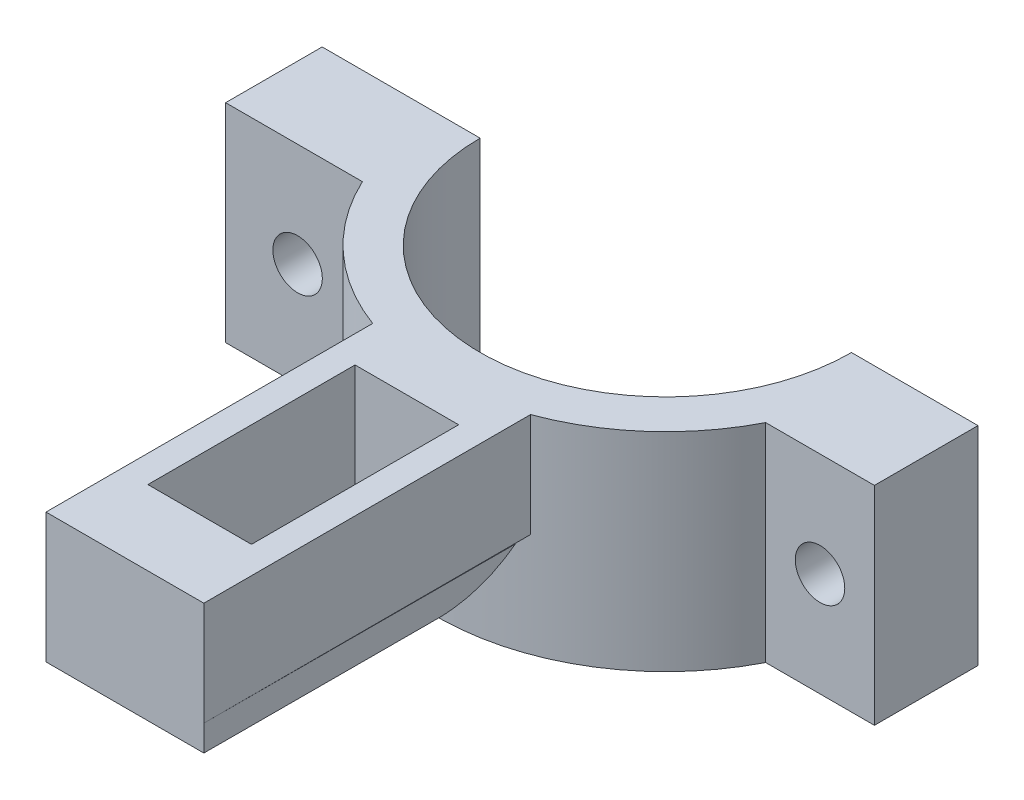
ISO-10303-21;
HEADER;
FILE_DESCRIPTION(('STEP AP214'),'2;1');
FILE_NAME('part.step','',(''),(''),'','','');
FILE_SCHEMA(('AUTOMOTIVE_DESIGN { 1 0 10303 214 1 1 1 1 }'));
ENDSEC;
DATA;
#1=APPLICATION_CONTEXT('core data for automotive mechanical design processes');
#2=APPLICATION_PROTOCOL_DEFINITION('international standard','automotive_design',2000,#1);
#3=PRODUCT_CONTEXT('',#1,'mechanical');
#4=PRODUCT('Part','Part','',(#3));
#5=PRODUCT_RELATED_PRODUCT_CATEGORY('part','',(#4));
#6=PRODUCT_DEFINITION_FORMATION('','',#4);
#7=PRODUCT_DEFINITION_CONTEXT('part definition',#1,'design');
#8=PRODUCT_DEFINITION('design','',#6,#7);
#9=PRODUCT_DEFINITION_SHAPE('','',#8);
#10=(LENGTH_UNIT() NAMED_UNIT(*) SI_UNIT(.MILLI.,.METRE.));
#11=(NAMED_UNIT(*) PLANE_ANGLE_UNIT() SI_UNIT($,.RADIAN.));
#12=(NAMED_UNIT(*) SI_UNIT($,.STERADIAN.) SOLID_ANGLE_UNIT());
#13=UNCERTAINTY_MEASURE_WITH_UNIT(LENGTH_MEASURE(1.E-05),#10,'distance_accuracy_value','');
#14=(GEOMETRIC_REPRESENTATION_CONTEXT(3) GLOBAL_UNCERTAINTY_ASSIGNED_CONTEXT((#13)) GLOBAL_UNIT_ASSIGNED_CONTEXT((#10,
#11,#12)) REPRESENTATION_CONTEXT('',''));
#15=CARTESIAN_POINT('',(0.,0.,0.));
#16=DIRECTION('',(0.,0.,1.));
#17=DIRECTION('',(1.,0.,0.));
#18=AXIS2_PLACEMENT_3D('',#15,#16,#17);
#19=CARTESIAN_POINT('',(-6.095,8.025,14.98));
#20=DIRECTION('',(0.,-1.,0.));
#21=DIRECTION('',(0.,0.,-1.));
#22=AXIS2_PLACEMENT_3D('',#19,#20,#21);
#23=PLANE('',#22);
#24=DIRECTION('',(0.,0.,1.));
#25=VECTOR('',#24,1.);
#26=CARTESIAN_POINT('',(6.095,8.025,14.98));
#27=LINE('',#26,#25);
#28=CARTESIAN_POINT('',(6.095,8.025,16.5429101127945));
#29=VERTEX_POINT('',#28);
#30=CARTESIAN_POINT('',(6.095,8.025,17.75));
#31=VERTEX_POINT('',#30);
#32=EDGE_CURVE('E279',#29,#31,#27,.T.);
#33=ORIENTED_EDGE('',*,*,#32,.T.);
#34=DIRECTION('',(1.,0.,0.));
#35=VECTOR('',#34,1.);
#36=CARTESIAN_POINT('',(-6.095,8.025,17.75));
#37=LINE('',#36,#35);
#38=CARTESIAN_POINT('',(-6.095,8.025,17.75));
#39=VERTEX_POINT('',#38);
#40=EDGE_CURVE('E193',#39,#31,#37,.T.);
#41=ORIENTED_EDGE('',*,*,#40,.F.);
#42=DIRECTION('',(0.,0.,1.));
#43=VECTOR('',#42,1.);
#44=CARTESIAN_POINT('',(-6.095,8.025,14.98));
#45=LINE('',#44,#43);
#46=CARTESIAN_POINT('',(-6.095,8.025,16.5429101127945));
#47=VERTEX_POINT('',#46);
#48=EDGE_CURVE('E277',#47,#39,#45,.T.);
#49=ORIENTED_EDGE('',*,*,#48,.F.);
#50=CARTESIAN_POINT('',(0.,8.025,0.));
#51=DIRECTION('',(0.,-1.,0.));
#52=DIRECTION('',(0.,0.,-1.));
#53=AXIS2_PLACEMENT_3D('',#50,#51,#52);
#54=CIRCLE('',#53,17.63);
#55=EDGE_CURVE('E317',#29,#47,#54,.T.);
#56=ORIENTED_EDGE('',*,*,#55,.F.);
#57=EDGE_LOOP('',(#33,#41,#49,#56));
#58=FACE_BOUND('',#57,.T.);
#59=ADVANCED_FACE('F41',(#58),#23,.T.);
#60=CARTESIAN_POINT('',(0.,16.05,0.));
#61=DIRECTION('',(0.,-1.,0.));
#62=DIRECTION('',(0.,0.,-1.));
#63=AXIS2_PLACEMENT_3D('',#60,#61,#62);
#64=CYLINDRICAL_SURFACE('',#63,17.63);
#65=CARTESIAN_POINT('',(0.,16.05,0.));
#66=DIRECTION('',(0.,1.,0.));
#67=DIRECTION('',(1.,0.,0.));
#68=AXIS2_PLACEMENT_3D('',#65,#66,#67);
#69=CIRCLE('',#68,17.63);
#70=CARTESIAN_POINT('',(-15.9755493799721,16.05,7.45645505639727));
#71=VERTEX_POINT('',#70);
#72=CARTESIAN_POINT('',(-6.095,16.05,16.5429101127945));
#73=VERTEX_POINT('',#72);
#74=EDGE_CURVE('E306',#71,#73,#69,.T.);
#75=ORIENTED_EDGE('',*,*,#74,.F.);
#76=DIRECTION('',(0.,-1.,0.));
#77=VECTOR('',#76,1.);
#78=CARTESIAN_POINT('',(-15.9755493799721,16.05,7.45645505639727));
#79=LINE('',#78,#77);
#80=CARTESIAN_POINT('',(-15.9755493799721,0.,7.45645505639727));
#81=VERTEX_POINT('',#80);
#82=EDGE_CURVE('E323',#71,#81,#79,.T.);
#83=ORIENTED_EDGE('',*,*,#82,.T.);
#84=CARTESIAN_POINT('',(0.,0.,0.));
#85=DIRECTION('',(0.,1.,0.));
#86=DIRECTION('',(1.,0.,0.));
#87=AXIS2_PLACEMENT_3D('',#84,#85,#86);
#88=CIRCLE('',#87,17.63);
#89=CARTESIAN_POINT('',(15.7104073785501,0.,8.));
#90=VERTEX_POINT('',#89);
#91=EDGE_CURVE('E303',#81,#90,#88,.T.);
#92=ORIENTED_EDGE('',*,*,#91,.T.);
#93=DIRECTION('',(0.,-1.,0.));
#94=VECTOR('',#93,1.);
#95=CARTESIAN_POINT('',(15.7104073785501,16.05,8.));
#96=LINE('',#95,#94);
#97=CARTESIAN_POINT('',(15.7104073785501,16.05,8.));
#98=VERTEX_POINT('',#97);
#99=EDGE_CURVE('E309',#90,#98,#96,.F.);
#100=ORIENTED_EDGE('',*,*,#99,.T.);
#101=CARTESIAN_POINT('',(6.095,16.05,16.5429101127945));
#102=VERTEX_POINT('',#101);
#103=EDGE_CURVE('E310',#102,#98,#69,.T.);
#104=ORIENTED_EDGE('',*,*,#103,.F.);
#105=DIRECTION('',(0.,-1.,0.));
#106=VECTOR('',#105,1.);
#107=CARTESIAN_POINT('',(6.095,16.05,16.5429101127945));
#108=LINE('',#107,#106);
#109=EDGE_CURVE('E320',#102,#29,#108,.T.);
#110=ORIENTED_EDGE('',*,*,#109,.T.);
#111=ORIENTED_EDGE('',*,*,#55,.T.);
#112=DIRECTION('',(0.,-1.,0.));
#113=VECTOR('',#112,1.);
#114=CARTESIAN_POINT('',(-6.095,16.05,16.5429101127945));
#115=LINE('',#114,#113);
#116=EDGE_CURVE('E314',#47,#73,#115,.F.);
#117=ORIENTED_EDGE('',*,*,#116,.T.);
#118=EDGE_LOOP('',(#75,#83,#92,#100,#104,#110,#111,#117));
#119=FACE_BOUND('',#118,.T.);
#120=ADVANCED_FACE('F341',(#119),#64,.T.);
#121=CARTESIAN_POINT('',(0.,16.05,0.));
#122=DIRECTION('',(0.,1.,0.));
#123=DIRECTION('',(0.,0.,1.));
#124=AXIS2_PLACEMENT_3D('',#121,#122,#123);
#125=PLANE('',#124);
#126=DIRECTION('',(0.,0.,-1.));
#127=VECTOR('',#126,1.);
#128=CARTESIAN_POINT('',(4.,16.05,20.0000000000001));
#129=LINE('',#128,#127);
#130=CARTESIAN_POINT('',(4.,16.05,36.0000000000001));
#131=VERTEX_POINT('',#130);
#132=CARTESIAN_POINT('',(4.,16.05,20.0000000000001));
#133=VERTEX_POINT('',#132);
#134=EDGE_CURVE('E205',#131,#133,#129,.T.);
#135=ORIENTED_EDGE('',*,*,#134,.F.);
#136=DIRECTION('',(1.,0.,0.));
#137=VECTOR('',#136,1.);
#138=CARTESIAN_POINT('',(-4.,16.05,36.0000000000001));
#139=LINE('',#138,#137);
#140=CARTESIAN_POINT('',(-4.,16.05,36.0000000000001));
#141=VERTEX_POINT('',#140);
#142=EDGE_CURVE('E210',#141,#131,#139,.T.);
#143=ORIENTED_EDGE('',*,*,#142,.F.);
#144=DIRECTION('',(0.,0.,1.));
#145=VECTOR('',#144,1.);
#146=CARTESIAN_POINT('',(-4.,16.05,20.0000000000001));
#147=LINE('',#146,#145);
#148=CARTESIAN_POINT('',(-4.,16.05,20.0000000000001));
#149=VERTEX_POINT('',#148);
#150=EDGE_CURVE('E224',#149,#141,#147,.T.);
#151=ORIENTED_EDGE('',*,*,#150,.F.);
#152=DIRECTION('',(-1.,0.,0.));
#153=VECTOR('',#152,1.);
#154=CARTESIAN_POINT('',(-4.,16.05,20.0000000000001));
#155=LINE('',#154,#153);
#156=EDGE_CURVE('E221',#133,#149,#155,.T.);
#157=ORIENTED_EDGE('',*,*,#156,.F.);
#158=EDGE_LOOP('',(#135,#143,#151,#157));
#159=FACE_BOUND('',#158,.T.);
#160=ORIENTED_EDGE('',*,*,#74,.T.);
#161=DIRECTION('',(0.,0.,1.));
#162=VECTOR('',#161,1.);
#163=CARTESIAN_POINT('',(-6.095,16.05,14.98));
#164=LINE('',#163,#162);
#165=CARTESIAN_POINT('',(-6.095,16.05,41.7733725275192));
#166=VERTEX_POINT('',#165);
#167=EDGE_CURVE('E179',#73,#166,#164,.T.);
#168=ORIENTED_EDGE('',*,*,#167,.T.);
#169=DIRECTION('',(-1.,0.,0.));
#170=VECTOR('',#169,1.);
#171=CARTESIAN_POINT('',(18.905,16.05,41.7733725275192));
#172=LINE('',#171,#170);
#173=CARTESIAN_POINT('',(6.095,16.05,41.7733725275192));
#174=VERTEX_POINT('',#173);
#175=EDGE_CURVE('E177',#174,#166,#172,.T.);
#176=ORIENTED_EDGE('',*,*,#175,.F.);
#177=DIRECTION('',(0.,0.,-1.));
#178=VECTOR('',#177,1.);
#179=CARTESIAN_POINT('',(6.095,16.05,14.98));
#180=LINE('',#179,#178);
#181=EDGE_CURVE('E240',#174,#102,#180,.T.);
#182=ORIENTED_EDGE('',*,*,#181,.T.);
#183=ORIENTED_EDGE('',*,*,#103,.T.);
#184=DIRECTION('',(1.,0.,0.));
#185=VECTOR('',#184,1.);
#186=CARTESIAN_POINT('',(14.75,16.05,8.));
#187=LINE('',#186,#185);
#188=CARTESIAN_POINT('',(24.11,16.05,8.));
#189=VERTEX_POINT('',#188);
#190=EDGE_CURVE('E293',#98,#189,#187,.T.);
#191=ORIENTED_EDGE('',*,*,#190,.T.);
#192=DIRECTION('',(0.,0.,1.));
#193=VECTOR('',#192,1.);
#194=CARTESIAN_POINT('',(24.11,16.05,-8.));
#195=LINE('',#194,#193);
#196=CARTESIAN_POINT('',(24.11,16.05,0.));
#197=VERTEX_POINT('',#196);
#198=EDGE_CURVE('E286',#197,#189,#195,.T.);
#199=ORIENTED_EDGE('',*,*,#198,.F.);
#200=DIRECTION('',(1.,0.,0.));
#201=VECTOR('',#200,1.);
#202=CARTESIAN_POINT('',(24.11,16.05,0.));
#203=LINE('',#202,#201);
#204=CARTESIAN_POINT('',(14.34,16.05,0.));
#205=VERTEX_POINT('',#204);
#206=EDGE_CURVE('E242',#205,#197,#203,.T.);
#207=ORIENTED_EDGE('',*,*,#206,.F.);
#208=CARTESIAN_POINT('',(0.,16.05,0.));
#209=DIRECTION('',(0.,1.,0.));
#210=DIRECTION('',(0.,0.,1.));
#211=AXIS2_PLACEMENT_3D('',#208,#209,#210);
#212=CIRCLE('',#211,14.34);
#213=CARTESIAN_POINT('',(-14.34,16.05,0.));
#214=VERTEX_POINT('',#213);
#215=EDGE_CURVE('E300',#214,#205,#212,.T.);
#216=ORIENTED_EDGE('',*,*,#215,.F.);
#217=CARTESIAN_POINT('',(-26.54,16.05,0.));
#218=VERTEX_POINT('',#217);
#219=EDGE_CURVE('E247',#218,#214,#203,.T.);
#220=ORIENTED_EDGE('',*,*,#219,.F.);
#221=DIRECTION('',(0.,0.,-1.));
#222=VECTOR('',#221,1.);
#223=CARTESIAN_POINT('',(-26.54,16.05,-8.54354494360273));
#224=LINE('',#223,#222);
#225=CARTESIAN_POINT('',(-26.54,16.05,7.45645505639727));
#226=VERTEX_POINT('',#225);
#227=EDGE_CURVE('E266',#226,#218,#224,.T.);
#228=ORIENTED_EDGE('',*,*,#227,.F.);
#229=DIRECTION('',(1.,0.,0.));
#230=VECTOR('',#229,1.);
#231=CARTESIAN_POINT('',(-27.75,16.05,7.45645505639727));
#232=LINE('',#231,#230);
#233=EDGE_CURVE('E275',#226,#71,#232,.T.);
#234=ORIENTED_EDGE('',*,*,#233,.T.);
#235=EDGE_LOOP('',(#160,#168,#176,#182,#183,#191,#199,#207,#216,#220,#228,#234));
#236=FACE_BOUND('',#235,.T.);
#237=ADVANCED_FACE('F349',(#159,#236),#125,.T.);
#238=CARTESIAN_POINT('',(0.,0.,0.));
#239=DIRECTION('',(0.,1.,0.));
#240=DIRECTION('',(0.,0.,1.));
#241=AXIS2_PLACEMENT_3D('',#238,#239,#240);
#242=PLANE('',#241);
#243=DIRECTION('',(0.,0.,-1.));
#244=VECTOR('',#243,1.);
#245=CARTESIAN_POINT('',(-26.54,0.,-8.54354494360273));
#246=LINE('',#245,#244);
#247=CARTESIAN_POINT('',(-26.54,0.,7.45645505639727));
#248=VERTEX_POINT('',#247);
#249=CARTESIAN_POINT('',(-26.54,0.,0.));
#250=VERTEX_POINT('',#249);
#251=EDGE_CURVE('E267',#248,#250,#246,.T.);
#252=ORIENTED_EDGE('',*,*,#251,.T.);
#253=DIRECTION('',(1.,0.,0.));
#254=VECTOR('',#253,1.);
#255=CARTESIAN_POINT('',(24.11,0.,0.));
#256=LINE('',#255,#254);
#257=CARTESIAN_POINT('',(-14.34,0.,0.));
#258=VERTEX_POINT('',#257);
#259=EDGE_CURVE('E246',#250,#258,#256,.T.);
#260=ORIENTED_EDGE('',*,*,#259,.T.);
#261=CARTESIAN_POINT('',(0.,0.,0.));
#262=DIRECTION('',(0.,1.,0.));
#263=DIRECTION('',(0.,0.,1.));
#264=AXIS2_PLACEMENT_3D('',#261,#262,#263);
#265=CIRCLE('',#264,14.34);
#266=CARTESIAN_POINT('',(14.34,0.,0.));
#267=VERTEX_POINT('',#266);
#268=EDGE_CURVE('E297',#258,#267,#265,.T.);
#269=ORIENTED_EDGE('',*,*,#268,.T.);
#270=CARTESIAN_POINT('',(24.11,0.,0.));
#271=VERTEX_POINT('',#270);
#272=EDGE_CURVE('E243',#267,#271,#256,.T.);
#273=ORIENTED_EDGE('',*,*,#272,.T.);
#274=DIRECTION('',(0.,0.,1.));
#275=VECTOR('',#274,1.);
#276=CARTESIAN_POINT('',(24.11,0.,-8.));
#277=LINE('',#276,#275);
#278=CARTESIAN_POINT('',(24.11,0.,8.));
#279=VERTEX_POINT('',#278);
#280=EDGE_CURVE('E287',#271,#279,#277,.T.);
#281=ORIENTED_EDGE('',*,*,#280,.T.);
#282=DIRECTION('',(1.,0.,0.));
#283=VECTOR('',#282,1.);
#284=CARTESIAN_POINT('',(14.75,0.,8.));
#285=LINE('',#284,#283);
#286=EDGE_CURVE('E294',#90,#279,#285,.T.);
#287=ORIENTED_EDGE('',*,*,#286,.F.);
#288=ORIENTED_EDGE('',*,*,#91,.F.);
#289=DIRECTION('',(1.,0.,0.));
#290=VECTOR('',#289,1.);
#291=CARTESIAN_POINT('',(-27.75,0.,7.45645505639727));
#292=LINE('',#291,#290);
#293=EDGE_CURVE('E274',#248,#81,#292,.T.);
#294=ORIENTED_EDGE('',*,*,#293,.F.);
#295=EDGE_LOOP('',(#252,#260,#269,#273,#281,#287,#288,#294));
#296=FACE_BOUND('',#295,.T.);
#297=ADVANCED_FACE('F364',(#296),#242,.F.);
#298=CARTESIAN_POINT('',(0.,16.05,0.));
#299=DIRECTION('',(0.,-1.,0.));
#300=DIRECTION('',(0.,0.,-1.));
#301=AXIS2_PLACEMENT_3D('',#298,#299,#300);
#302=CYLINDRICAL_SURFACE('',#301,14.34);
#303=DIRECTION('',(0.,-1.,0.));
#304=VECTOR('',#303,1.);
#305=CARTESIAN_POINT('',(-14.34,16.05,0.));
#306=LINE('',#305,#304);
#307=EDGE_CURVE('E261',#214,#258,#306,.T.);
#308=ORIENTED_EDGE('',*,*,#307,.F.);
#309=ORIENTED_EDGE('',*,*,#215,.T.);
#310=DIRECTION('',(0.,-1.,0.));
#311=VECTOR('',#310,1.);
#312=CARTESIAN_POINT('',(14.34,16.05,0.));
#313=LINE('',#312,#311);
#314=EDGE_CURVE('E259',#267,#205,#313,.F.);
#315=ORIENTED_EDGE('',*,*,#314,.F.);
#316=ORIENTED_EDGE('',*,*,#268,.F.);
#317=EDGE_LOOP('',(#308,#309,#315,#316));
#318=FACE_BOUND('',#317,.T.);
#319=ADVANCED_FACE('F376',(#318),#302,.F.);
#320=CARTESIAN_POINT('',(14.75,16.05,8.));
#321=DIRECTION('',(0.,0.,1.));
#322=DIRECTION('',(1.,0.,0.));
#323=AXIS2_PLACEMENT_3D('',#320,#321,#322);
#324=PLANE('',#323);
#325=CARTESIAN_POINT('',(19.9102036892766,8.02500000000175,8.));
#326=DIRECTION('',(0.,0.,1.));
#327=DIRECTION('',(1.,0.,0.));
#328=AXIS2_PLACEMENT_3D('',#325,#326,#327);
#329=CIRCLE('',#328,1.91);
#330=CARTESIAN_POINT('',(21.8202036892766,8.02500000000175,8.));
#331=VERTEX_POINT('',#330);
#332=EDGE_CURVE('E282',#331,#331,#329,.T.);
#333=ORIENTED_EDGE('',*,*,#332,.F.);
#334=EDGE_LOOP('',(#333));
#335=FACE_BOUND('',#334,.T.);
#336=DIRECTION('',(0.,1.,0.));
#337=VECTOR('',#336,1.);
#338=CARTESIAN_POINT('',(24.11,0.,8.));
#339=LINE('',#338,#337);
#340=EDGE_CURVE('E289',#279,#189,#339,.T.);
#341=ORIENTED_EDGE('',*,*,#340,.T.);
#342=ORIENTED_EDGE('',*,*,#190,.F.);
#343=ORIENTED_EDGE('',*,*,#99,.F.);
#344=ORIENTED_EDGE('',*,*,#286,.T.);
#345=EDGE_LOOP('',(#341,#342,#343,#344));
#346=FACE_BOUND('',#345,.T.);
#347=ADVANCED_FACE('F363',(#335,#346),#324,.T.);
#348=CARTESIAN_POINT('',(24.11,0.,-8.));
#349=DIRECTION('',(-1.,0.,0.));
#350=DIRECTION('',(0.,0.,1.));
#351=AXIS2_PLACEMENT_3D('',#348,#349,#350);
#352=PLANE('',#351);
#353=ORIENTED_EDGE('',*,*,#280,.F.);
#354=DIRECTION('',(0.,1.,0.));
#355=VECTOR('',#354,1.);
#356=CARTESIAN_POINT('',(24.11,0.,0.));
#357=LINE('',#356,#355);
#358=EDGE_CURVE('E249',#271,#197,#357,.T.);
#359=ORIENTED_EDGE('',*,*,#358,.T.);
#360=ORIENTED_EDGE('',*,*,#198,.T.);
#361=ORIENTED_EDGE('',*,*,#340,.F.);
#362=EDGE_LOOP('',(#353,#359,#360,#361));
#363=FACE_BOUND('',#362,.T.);
#364=ADVANCED_FACE('F368',(#363),#352,.F.);
#365=CARTESIAN_POINT('',(19.9102036892766,8.02500000000175,-17.63));
#366=DIRECTION('',(0.,0.,1.));
#367=DIRECTION('',(1.,0.,0.));
#368=AXIS2_PLACEMENT_3D('',#365,#366,#367);
#369=CYLINDRICAL_SURFACE('',#368,1.91);
#370=CARTESIAN_POINT('',(19.9102036892766,8.02500000000175,0.));
#371=DIRECTION('',(0.,0.,1.));
#372=DIRECTION('',(1.,0.,0.));
#373=AXIS2_PLACEMENT_3D('',#370,#371,#372);
#374=CIRCLE('',#373,1.91);
#375=CARTESIAN_POINT('',(21.8202036892766,8.02500000000175,0.));
#376=VERTEX_POINT('',#375);
#377=EDGE_CURVE('E256',#376,#376,#374,.F.);
#378=ORIENTED_EDGE('',*,*,#377,.T.);
#379=EDGE_LOOP('',(#378));
#380=FACE_BOUND('',#379,.T.);
#381=ORIENTED_EDGE('',*,*,#332,.T.);
#382=EDGE_LOOP('',(#381));
#383=FACE_BOUND('',#382,.T.);
#384=ADVANCED_FACE('F405',(#380,#383),#369,.F.);
#385=CARTESIAN_POINT('',(6.095,16.2886259485937,14.98));
#386=DIRECTION('',(1.,0.,0.));
#387=DIRECTION('',(0.,1.,0.));
#388=AXIS2_PLACEMENT_3D('',#385,#386,#387);
#389=PLANE('',#388);
#390=DIRECTION('',(0.,1.,0.));
#391=VECTOR('',#390,1.);
#392=CARTESIAN_POINT('',(6.095,16.05,41.7733725275192));
#393=LINE('',#392,#391);
#394=CARTESIAN_POINT('',(6.095,8.025,41.7733725275192));
#395=VERTEX_POINT('',#394);
#396=EDGE_CURVE('E180',#395,#174,#393,.T.);
#397=ORIENTED_EDGE('',*,*,#396,.F.);
#398=DIRECTION('',(0.,0.,-1.));
#399=VECTOR('',#398,1.);
#400=CARTESIAN_POINT('',(6.095,8.025,14.98));
#401=LINE('',#400,#399);
#402=EDGE_CURVE('E202',#395,#31,#401,.T.);
#403=ORIENTED_EDGE('',*,*,#402,.T.);
#404=ORIENTED_EDGE('',*,*,#32,.F.);
#405=ORIENTED_EDGE('',*,*,#109,.F.);
#406=ORIENTED_EDGE('',*,*,#181,.F.);
#407=EDGE_LOOP('',(#397,#403,#404,#405,#406));
#408=FACE_BOUND('',#407,.T.);
#409=ADVANCED_FACE('F346',(#408),#389,.T.);
#410=CARTESIAN_POINT('',(-6.095,16.2886259485937,14.98));
#411=DIRECTION('',(-1.,0.,0.));
#412=DIRECTION('',(0.,-1.,0.));
#413=AXIS2_PLACEMENT_3D('',#410,#411,#412);
#414=PLANE('',#413);
#415=ORIENTED_EDGE('',*,*,#48,.T.);
#416=CARTESIAN_POINT('',(-6.095,16.025,23.75));
#417=DIRECTION('',(-1.,0.,0.));
#418=DIRECTION('',(0.,-1.,0.));
#419=AXIS2_PLACEMENT_3D('',#416,#417,#418);
#420=CIRCLE('',#419,10.);
#421=CARTESIAN_POINT('',(-6.095,6.025,23.75));
#422=VERTEX_POINT('',#421);
#423=EDGE_CURVE('E12',#39,#422,#420,.T.);
#424=ORIENTED_EDGE('',*,*,#423,.T.);
#425=DIRECTION('',(0.,0.,-1.));
#426=VECTOR('',#425,1.);
#427=CARTESIAN_POINT('',(-6.09500000000001,6.025,41.7733725275192));
#428=LINE('',#427,#426);
#429=CARTESIAN_POINT('',(-6.09500000000001,6.025,41.7733725275192));
#430=VERTEX_POINT('',#429);
#431=EDGE_CURVE('E182',#430,#422,#428,.T.);
#432=ORIENTED_EDGE('',*,*,#431,.F.);
#433=DIRECTION('',(0.,-1.,0.));
#434=VECTOR('',#433,1.);
#435=CARTESIAN_POINT('',(-6.095,16.2886259485937,41.7733725275192));
#436=LINE('',#435,#434);
#437=EDGE_CURVE('E172',#166,#430,#436,.T.);
#438=ORIENTED_EDGE('',*,*,#437,.F.);
#439=ORIENTED_EDGE('',*,*,#167,.F.);
#440=ORIENTED_EDGE('',*,*,#116,.F.);
#441=EDGE_LOOP('',(#415,#424,#432,#438,#439,#440));
#442=FACE_BOUND('',#441,.T.);
#443=ADVANCED_FACE('F183',(#442),#414,.T.);
#444=CARTESIAN_POINT('',(-27.75,16.05,7.45645505639727));
#445=DIRECTION('',(0.,0.,1.));
#446=DIRECTION('',(1.,0.,0.));
#447=AXIS2_PLACEMENT_3D('',#444,#445,#446);
#448=PLANE('',#447);
#449=CARTESIAN_POINT('',(-20.9807836793096,8.02500000000175,7.45645505639727));
#450=DIRECTION('',(0.,0.,1.));
#451=DIRECTION('',(1.,0.,0.));
#452=AXIS2_PLACEMENT_3D('',#449,#450,#451);
#453=CIRCLE('',#452,1.91);
#454=CARTESIAN_POINT('',(-19.0707836793096,8.02500000000175,7.45645505639727));
#455=VERTEX_POINT('',#454);
#456=EDGE_CURVE('E263',#455,#455,#453,.T.);
#457=ORIENTED_EDGE('',*,*,#456,.F.);
#458=EDGE_LOOP('',(#457));
#459=FACE_BOUND('',#458,.T.);
#460=DIRECTION('',(0.,1.,0.));
#461=VECTOR('',#460,1.);
#462=CARTESIAN_POINT('',(-26.54,0.,7.45645505639727));
#463=LINE('',#462,#461);
#464=EDGE_CURVE('E270',#248,#226,#463,.T.);
#465=ORIENTED_EDGE('',*,*,#464,.F.);
#466=ORIENTED_EDGE('',*,*,#293,.T.);
#467=ORIENTED_EDGE('',*,*,#82,.F.);
#468=ORIENTED_EDGE('',*,*,#233,.F.);
#469=EDGE_LOOP('',(#465,#466,#467,#468));
#470=FACE_BOUND('',#469,.T.);
#471=ADVANCED_FACE('F355',(#459,#470),#448,.T.);
#472=CARTESIAN_POINT('',(-26.54,0.,-8.54354494360273));
#473=DIRECTION('',(1.,0.,0.));
#474=DIRECTION('',(0.,0.,-1.));
#475=AXIS2_PLACEMENT_3D('',#472,#473,#474);
#476=PLANE('',#475);
#477=ORIENTED_EDGE('',*,*,#227,.T.);
#478=DIRECTION('',(0.,-1.,0.));
#479=VECTOR('',#478,1.);
#480=CARTESIAN_POINT('',(-26.54,0.,0.));
#481=LINE('',#480,#479);
#482=EDGE_CURVE('E253',#218,#250,#481,.T.);
#483=ORIENTED_EDGE('',*,*,#482,.T.);
#484=ORIENTED_EDGE('',*,*,#251,.F.);
#485=ORIENTED_EDGE('',*,*,#464,.T.);
#486=EDGE_LOOP('',(#477,#483,#484,#485));
#487=FACE_BOUND('',#486,.T.);
#488=ADVANCED_FACE('F383',(#487),#476,.F.);
#489=CARTESIAN_POINT('',(-20.9807836793096,8.02500000000176,21.75));
#490=DIRECTION('',(0.,0.,-1.));
#491=DIRECTION('',(0.,1.,0.));
#492=AXIS2_PLACEMENT_3D('',#489,#490,#491);
#493=CYLINDRICAL_SURFACE('',#492,1.91);
#494=CARTESIAN_POINT('',(-20.9807836793096,8.02500000000175,0.));
#495=DIRECTION('',(0.,0.,1.));
#496=DIRECTION('',(1.,0.,0.));
#497=AXIS2_PLACEMENT_3D('',#494,#495,#496);
#498=CIRCLE('',#497,1.91);
#499=CARTESIAN_POINT('',(-19.0707836793096,8.02500000000175,0.));
#500=VERTEX_POINT('',#499);
#501=EDGE_CURVE('E252',#500,#500,#498,.F.);
#502=ORIENTED_EDGE('',*,*,#501,.T.);
#503=EDGE_LOOP('',(#502));
#504=FACE_BOUND('',#503,.T.);
#505=ORIENTED_EDGE('',*,*,#456,.T.);
#506=EDGE_LOOP('',(#505));
#507=FACE_BOUND('',#506,.T.);
#508=ADVANCED_FACE('F385',(#504,#507),#493,.F.);
#509=CARTESIAN_POINT('',(24.11,0.,0.));
#510=DIRECTION('',(0.,0.,1.));
#511=DIRECTION('',(1.,0.,0.));
#512=AXIS2_PLACEMENT_3D('',#509,#510,#511);
#513=PLANE('',#512);
#514=ORIENTED_EDGE('',*,*,#307,.T.);
#515=ORIENTED_EDGE('',*,*,#259,.F.);
#516=ORIENTED_EDGE('',*,*,#482,.F.);
#517=ORIENTED_EDGE('',*,*,#219,.T.);
#518=EDGE_LOOP('',(#514,#515,#516,#517));
#519=FACE_BOUND('',#518,.T.);
#520=ORIENTED_EDGE('',*,*,#501,.F.);
#521=EDGE_LOOP('',(#520));
#522=FACE_BOUND('',#521,.T.);
#523=ADVANCED_FACE('F380',(#519,#522),#513,.F.);
#524=ORIENTED_EDGE('',*,*,#314,.T.);
#525=ORIENTED_EDGE('',*,*,#206,.T.);
#526=ORIENTED_EDGE('',*,*,#358,.F.);
#527=ORIENTED_EDGE('',*,*,#272,.F.);
#528=EDGE_LOOP('',(#524,#525,#526,#527));
#529=FACE_BOUND('',#528,.T.);
#530=ORIENTED_EDGE('',*,*,#377,.F.);
#531=EDGE_LOOP('',(#530));
#532=FACE_BOUND('',#531,.T.);
#533=ADVANCED_FACE('F476',(#529,#532),#513,.F.);
#534=CARTESIAN_POINT('',(-22.905,16.05,41.7733725275192));
#535=DIRECTION('',(0.,0.,-1.));
#536=DIRECTION('',(-1.,0.,0.));
#537=AXIS2_PLACEMENT_3D('',#534,#535,#536);
#538=PLANE('',#537);
#539=ORIENTED_EDGE('',*,*,#175,.T.);
#540=ORIENTED_EDGE('',*,*,#437,.T.);
#541=DIRECTION('',(-1.,0.,0.));
#542=VECTOR('',#541,1.);
#543=CARTESIAN_POINT('',(6.095,6.025,41.7733725275192));
#544=LINE('',#543,#542);
#545=CARTESIAN_POINT('',(6.095,6.025,41.7733725275192));
#546=VERTEX_POINT('',#545);
#547=EDGE_CURVE('E175',#546,#430,#544,.T.);
#548=ORIENTED_EDGE('',*,*,#547,.F.);
#549=DIRECTION('',(0.,1.,0.));
#550=VECTOR('',#549,1.);
#551=CARTESIAN_POINT('',(6.095,6.025,41.7733725275192));
#552=LINE('',#551,#550);
#553=EDGE_CURVE('E197',#546,#395,#552,.T.);
#554=ORIENTED_EDGE('',*,*,#553,.T.);
#555=ORIENTED_EDGE('',*,*,#396,.T.);
#556=EDGE_LOOP('',(#539,#540,#548,#554,#555));
#557=FACE_BOUND('',#556,.T.);
#558=ADVANCED_FACE('F173',(#557),#538,.F.);
#559=CARTESIAN_POINT('',(4.,8.05,20.0000000000001));
#560=DIRECTION('',(1.,0.,0.));
#561=DIRECTION('',(0.,0.,-1.));
#562=AXIS2_PLACEMENT_3D('',#559,#560,#561);
#563=PLANE('',#562);
#564=ORIENTED_EDGE('',*,*,#134,.T.);
#565=DIRECTION('',(0.,1.,0.));
#566=VECTOR('',#565,1.);
#567=CARTESIAN_POINT('',(4.,8.05,20.0000000000001));
#568=LINE('',#567,#566);
#569=CARTESIAN_POINT('',(4.,8.05,20.0000000000001));
#570=VERTEX_POINT('',#569);
#571=EDGE_CURVE('E219',#570,#133,#568,.T.);
#572=ORIENTED_EDGE('',*,*,#571,.F.);
#573=DIRECTION('',(0.,0.,-1.));
#574=VECTOR('',#573,1.);
#575=CARTESIAN_POINT('',(4.,8.05,20.0000000000001));
#576=LINE('',#575,#574);
#577=CARTESIAN_POINT('',(4.,8.05,36.0000000000001));
#578=VERTEX_POINT('',#577);
#579=EDGE_CURVE('E206',#578,#570,#576,.T.);
#580=ORIENTED_EDGE('',*,*,#579,.F.);
#581=DIRECTION('',(0.,1.,0.));
#582=VECTOR('',#581,1.);
#583=CARTESIAN_POINT('',(4.,8.05,36.0000000000001));
#584=LINE('',#583,#582);
#585=EDGE_CURVE('E229',#578,#131,#584,.T.);
#586=ORIENTED_EDGE('',*,*,#585,.T.);
#587=EDGE_LOOP('',(#564,#572,#580,#586));
#588=FACE_BOUND('',#587,.T.);
#589=ADVANCED_FACE('F516',(#588),#563,.F.);
#590=CARTESIAN_POINT('',(-4.,8.05,36.0000000000001));
#591=DIRECTION('',(0.,0.,1.));
#592=DIRECTION('',(1.,0.,0.));
#593=AXIS2_PLACEMENT_3D('',#590,#591,#592);
#594=PLANE('',#593);
#595=ORIENTED_EDGE('',*,*,#142,.T.);
#596=ORIENTED_EDGE('',*,*,#585,.F.);
#597=DIRECTION('',(1.,0.,0.));
#598=VECTOR('',#597,1.);
#599=CARTESIAN_POINT('',(-4.,8.05,36.0000000000001));
#600=LINE('',#599,#598);
#601=CARTESIAN_POINT('',(-4.,8.05,36.0000000000001));
#602=VERTEX_POINT('',#601);
#603=EDGE_CURVE('E216',#602,#578,#600,.T.);
#604=ORIENTED_EDGE('',*,*,#603,.F.);
#605=DIRECTION('',(0.,1.,0.));
#606=VECTOR('',#605,1.);
#607=CARTESIAN_POINT('',(-4.,8.05,36.0000000000001));
#608=LINE('',#607,#606);
#609=EDGE_CURVE('E231',#602,#141,#608,.T.);
#610=ORIENTED_EDGE('',*,*,#609,.T.);
#611=EDGE_LOOP('',(#595,#596,#604,#610));
#612=FACE_BOUND('',#611,.T.);
#613=ADVANCED_FACE('F529',(#612),#594,.F.);
#614=CARTESIAN_POINT('',(-4.,8.05,20.0000000000001));
#615=DIRECTION('',(-1.,0.,0.));
#616=DIRECTION('',(0.,0.,1.));
#617=AXIS2_PLACEMENT_3D('',#614,#615,#616);
#618=PLANE('',#617);
#619=ORIENTED_EDGE('',*,*,#150,.T.);
#620=ORIENTED_EDGE('',*,*,#609,.F.);
#621=DIRECTION('',(0.,0.,1.));
#622=VECTOR('',#621,1.);
#623=CARTESIAN_POINT('',(-4.,8.05,20.0000000000001));
#624=LINE('',#623,#622);
#625=CARTESIAN_POINT('',(-4.,8.05,20.0000000000001));
#626=VERTEX_POINT('',#625);
#627=EDGE_CURVE('E213',#626,#602,#624,.T.);
#628=ORIENTED_EDGE('',*,*,#627,.F.);
#629=DIRECTION('',(0.,1.,0.));
#630=VECTOR('',#629,1.);
#631=CARTESIAN_POINT('',(-4.,8.05,20.0000000000001));
#632=LINE('',#631,#630);
#633=EDGE_CURVE('E233',#626,#149,#632,.T.);
#634=ORIENTED_EDGE('',*,*,#633,.T.);
#635=EDGE_LOOP('',(#619,#620,#628,#634));
#636=FACE_BOUND('',#635,.T.);
#637=ADVANCED_FACE('F538',(#636),#618,.F.);
#638=CARTESIAN_POINT('',(-4.,8.05,20.0000000000001));
#639=DIRECTION('',(0.,0.,-1.));
#640=DIRECTION('',(-1.,0.,0.));
#641=AXIS2_PLACEMENT_3D('',#638,#639,#640);
#642=PLANE('',#641);
#643=ORIENTED_EDGE('',*,*,#156,.T.);
#644=ORIENTED_EDGE('',*,*,#633,.F.);
#645=DIRECTION('',(-1.,0.,0.));
#646=VECTOR('',#645,1.);
#647=CARTESIAN_POINT('',(-4.,8.05,20.0000000000001));
#648=LINE('',#647,#646);
#649=EDGE_CURVE('E209',#570,#626,#648,.T.);
#650=ORIENTED_EDGE('',*,*,#649,.F.);
#651=ORIENTED_EDGE('',*,*,#571,.T.);
#652=EDGE_LOOP('',(#643,#644,#650,#651));
#653=FACE_BOUND('',#652,.T.);
#654=ADVANCED_FACE('F547',(#653),#642,.F.);
#655=CARTESIAN_POINT('',(0.,8.05,0.));
#656=DIRECTION('',(0.,1.,0.));
#657=DIRECTION('',(0.,0.,1.));
#658=AXIS2_PLACEMENT_3D('',#655,#656,#657);
#659=PLANE('',#658);
#660=ORIENTED_EDGE('',*,*,#579,.T.);
#661=ORIENTED_EDGE('',*,*,#649,.T.);
#662=ORIENTED_EDGE('',*,*,#627,.T.);
#663=ORIENTED_EDGE('',*,*,#603,.T.);
#664=EDGE_LOOP('',(#660,#661,#662,#663));
#665=FACE_BOUND('',#664,.T.);
#666=ADVANCED_FACE('F556',(#665),#659,.T.);
#667=CARTESIAN_POINT('',(6.13829314044067,6.025,17.75));
#668=DIRECTION('',(-0.99999837617518,0.,-0.00180212291553158));
#669=DIRECTION('',(-0.00180212291553158,0.,0.99999837617518));
#670=AXIS2_PLACEMENT_3D('',#667,#668,#669);
#671=PLANE('',#670);
#672=DIRECTION('',(-0.00180212291553158,0.,0.99999837617518));
#673=VECTOR('',#672,1.);
#674=CARTESIAN_POINT('',(6.13829314044067,6.025,17.75));
#675=LINE('',#674,#673);
#676=CARTESIAN_POINT('',(6.12748038538946,6.025,23.75));
#677=VERTEX_POINT('',#676);
#678=EDGE_CURVE('E185',#677,#546,#675,.T.);
#679=ORIENTED_EDGE('',*,*,#678,.F.);
#680=CARTESIAN_POINT('',(6.12748038538946,16.025,23.75));
#681=DIRECTION('',(-0.99999837617518,0.,-0.00180212291553158));
#682=DIRECTION('',(0.00180212291553158,0.,-0.99999837617518));
#683=AXIS2_PLACEMENT_3D('',#680,#681,#682);
#684=ELLIPSE('',#683,10.0000162382746,10.);
#685=CARTESIAN_POINT('',(6.13829314044067,8.025,17.75));
#686=VERTEX_POINT('',#685);
#687=EDGE_CURVE('E49',#677,#686,#684,.F.);
#688=ORIENTED_EDGE('',*,*,#687,.T.);
#689=DIRECTION('',(-0.00180212291553158,0.,0.99999837617518));
#690=VECTOR('',#689,1.);
#691=CARTESIAN_POINT('',(6.13829314044067,8.025,17.75));
#692=LINE('',#691,#690);
#693=EDGE_CURVE('E190',#686,#395,#692,.T.);
#694=ORIENTED_EDGE('',*,*,#693,.T.);
#695=ORIENTED_EDGE('',*,*,#553,.F.);
#696=EDGE_LOOP('',(#679,#688,#694,#695));
#697=FACE_BOUND('',#696,.T.);
#698=ADVANCED_FACE('F331',(#697),#671,.F.);
#699=CARTESIAN_POINT('',(0.,6.025,0.));
#700=DIRECTION('',(0.,-1.,0.));
#701=DIRECTION('',(0.,0.,-1.));
#702=AXIS2_PLACEMENT_3D('',#699,#700,#701);
#703=PLANE('',#702);
#704=ORIENTED_EDGE('',*,*,#431,.T.);
#705=DIRECTION('',(-1.,0.,0.));
#706=VECTOR('',#705,1.);
#707=CARTESIAN_POINT('',(6.13829314044067,6.025,23.75));
#708=LINE('',#707,#706);
#709=EDGE_CURVE('E326',#422,#677,#708,.F.);
#710=ORIENTED_EDGE('',*,*,#709,.T.);
#711=ORIENTED_EDGE('',*,*,#678,.T.);
#712=ORIENTED_EDGE('',*,*,#547,.T.);
#713=EDGE_LOOP('',(#704,#710,#711,#712));
#714=FACE_BOUND('',#713,.T.);
#715=ADVANCED_FACE('F187',(#714),#703,.T.);
#716=CARTESIAN_POINT('',(0.,8.025,0.));
#717=DIRECTION('',(0.,-1.,0.));
#718=DIRECTION('',(0.,0.,-1.));
#719=AXIS2_PLACEMENT_3D('',#716,#717,#718);
#720=PLANE('',#719);
#721=ORIENTED_EDGE('',*,*,#402,.F.);
#722=ORIENTED_EDGE('',*,*,#693,.F.);
#723=EDGE_CURVE('E199',#31,#686,#37,.T.);
#724=ORIENTED_EDGE('',*,*,#723,.F.);
#725=EDGE_LOOP('',(#721,#722,#724));
#726=FACE_BOUND('',#725,.T.);
#727=ADVANCED_FACE('F334',(#726),#720,.F.);
#728=CARTESIAN_POINT('',(-6.095,16.025,23.75));
#729=DIRECTION('',(1.,0.,0.));
#730=DIRECTION('',(0.,0.,-1.));
#731=AXIS2_PLACEMENT_3D('',#728,#729,#730);
#732=CYLINDRICAL_SURFACE('',#731,10.);
#733=ORIENTED_EDGE('',*,*,#40,.T.);
#734=ORIENTED_EDGE('',*,*,#723,.T.);
#735=ORIENTED_EDGE('',*,*,#687,.F.);
#736=ORIENTED_EDGE('',*,*,#709,.F.);
#737=ORIENTED_EDGE('',*,*,#423,.F.);
#738=EDGE_LOOP('',(#733,#734,#735,#736,#737));
#739=FACE_BOUND('',#738,.T.);
#740=ADVANCED_FACE('F43',(#739),#732,.T.);
#741=CLOSED_SHELL('',(#59,#120,#237,#297,#319,#347,#364,#384,#409,#443,#471,#488,#508,#523,#533,
#558,#589,#613,#637,#654,#666,#698,#715,#727,#740));
#742=MANIFOLD_SOLID_BREP('B2',#741);
#743=ADVANCED_BREP_SHAPE_REPRESENTATION('',(#18,#742),#14);
#744=SHAPE_DEFINITION_REPRESENTATION(#9,#743);
ENDSEC;
END-ISO-10303-21;
